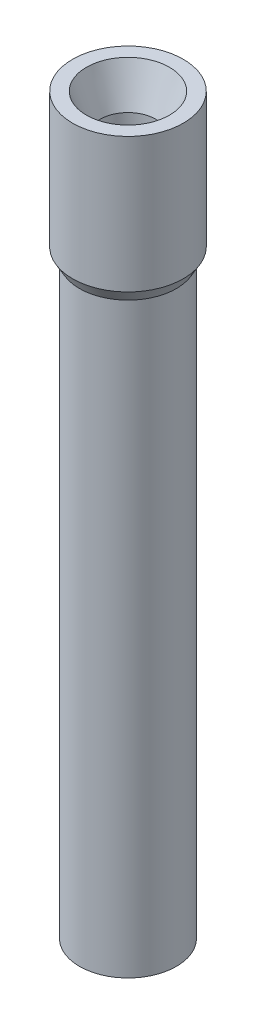
ISO-10303-21;
HEADER;
FILE_DESCRIPTION(('STEP AP214'),'2;1');
FILE_NAME('part.step','',(''),(''),'','','');
FILE_SCHEMA(('AUTOMOTIVE_DESIGN { 1 0 10303 214 1 1 1 1 }'));
ENDSEC;
DATA;
#1=APPLICATION_CONTEXT('core data for automotive mechanical design processes');
#2=APPLICATION_PROTOCOL_DEFINITION('international standard','automotive_design',2000,#1);
#3=PRODUCT_CONTEXT('',#1,'mechanical');
#4=PRODUCT('Part','Part','',(#3));
#5=PRODUCT_RELATED_PRODUCT_CATEGORY('part','',(#4));
#6=PRODUCT_DEFINITION_FORMATION('','',#4);
#7=PRODUCT_DEFINITION_CONTEXT('part definition',#1,'design');
#8=PRODUCT_DEFINITION('design','',#6,#7);
#9=PRODUCT_DEFINITION_SHAPE('','',#8);
#10=(LENGTH_UNIT() NAMED_UNIT(*) SI_UNIT(.MILLI.,.METRE.));
#11=(NAMED_UNIT(*) PLANE_ANGLE_UNIT() SI_UNIT($,.RADIAN.));
#12=(NAMED_UNIT(*) SI_UNIT($,.STERADIAN.) SOLID_ANGLE_UNIT());
#13=UNCERTAINTY_MEASURE_WITH_UNIT(LENGTH_MEASURE(1.E-05),#10,'distance_accuracy_value','');
#14=(GEOMETRIC_REPRESENTATION_CONTEXT(3) GLOBAL_UNCERTAINTY_ASSIGNED_CONTEXT((#13)) GLOBAL_UNIT_ASSIGNED_CONTEXT((#10,
#11,#12)) REPRESENTATION_CONTEXT('',''));
#15=CARTESIAN_POINT('',(0.,0.,0.));
#16=DIRECTION('',(0.,0.,1.));
#17=DIRECTION('',(1.,0.,0.));
#18=AXIS2_PLACEMENT_3D('',#15,#16,#17);
#19=CARTESIAN_POINT('',(0.,8.,0.));
#20=DIRECTION('',(0.,-1.,0.));
#21=DIRECTION('',(0.,0.,-1.));
#22=AXIS2_PLACEMENT_3D('',#19,#20,#21);
#23=CYLINDRICAL_SURFACE('',#22,4.);
#24=CARTESIAN_POINT('',(0.,-1.73205080756891,0.));
#25=DIRECTION('',(0.,1.,0.));
#26=DIRECTION('',(0.,0.,1.));
#27=AXIS2_PLACEMENT_3D('',#24,#25,#26);
#28=CIRCLE('',#27,4.);
#29=CARTESIAN_POINT('',(0.,-1.73205080756891,4.));
#30=VERTEX_POINT('',#29);
#31=EDGE_CURVE('E51',#30,#30,#28,.T.);
#32=ORIENTED_EDGE('',*,*,#31,.T.);
#33=EDGE_LOOP('',(#32));
#34=FACE_BOUND('',#33,.T.);
#35=CARTESIAN_POINT('',(0.,8.,0.));
#36=DIRECTION('',(0.,1.,0.));
#37=DIRECTION('',(0.,0.,1.));
#38=AXIS2_PLACEMENT_3D('',#35,#36,#37);
#39=CIRCLE('',#38,4.);
#40=CARTESIAN_POINT('',(0.,8.,4.));
#41=VERTEX_POINT('',#40);
#42=EDGE_CURVE('E60',#41,#41,#39,.T.);
#43=ORIENTED_EDGE('',*,*,#42,.F.);
#44=EDGE_LOOP('',(#43));
#45=FACE_BOUND('',#44,.T.);
#46=ADVANCED_FACE('F39',(#34,#45),#23,.T.);
#47=CARTESIAN_POINT('',(0.,8.,0.));
#48=DIRECTION('',(0.,1.,0.));
#49=DIRECTION('',(0.,0.,1.));
#50=AXIS2_PLACEMENT_3D('',#47,#48,#49);
#51=PLANE('',#50);
#52=CARTESIAN_POINT('',(0.,8.,0.));
#53=DIRECTION('',(0.,1.,0.));
#54=DIRECTION('',(0.,0.,1.));
#55=AXIS2_PLACEMENT_3D('',#52,#53,#54);
#56=CIRCLE('',#55,3.);
#57=CARTESIAN_POINT('',(0.,8.,3.));
#58=VERTEX_POINT('',#57);
#59=EDGE_CURVE('E10',#58,#58,#56,.F.);
#60=ORIENTED_EDGE('',*,*,#59,.T.);
#61=EDGE_LOOP('',(#60));
#62=FACE_BOUND('',#61,.T.);
#63=ORIENTED_EDGE('',*,*,#42,.T.);
#64=EDGE_LOOP('',(#63));
#65=FACE_BOUND('',#64,.T.);
#66=ADVANCED_FACE('F81',(#62,#65),#51,.T.);
#67=CARTESIAN_POINT('',(0.,-45.,0.));
#68=DIRECTION('',(0.,1.,0.));
#69=DIRECTION('',(0.,0.,1.));
#70=AXIS2_PLACEMENT_3D('',#67,#68,#69);
#71=CYLINDRICAL_SURFACE('',#70,3.5);
#72=CARTESIAN_POINT('',(0.,-2.59807621135336,0.));
#73=DIRECTION('',(0.,1.,0.));
#74=DIRECTION('',(0.,0.,1.));
#75=AXIS2_PLACEMENT_3D('',#72,#73,#74);
#76=CIRCLE('',#75,3.5);
#77=CARTESIAN_POINT('',(0.,-2.59807621135336,3.5));
#78=VERTEX_POINT('',#77);
#79=EDGE_CURVE('E55',#78,#78,#76,.F.);
#80=CARTESIAN_POINT('',(0.,-45.,0.));
#81=DIRECTION('',(0.,-1.,0.));
#82=DIRECTION('',(0.,0.,-1.));
#83=AXIS2_PLACEMENT_3D('',#80,#81,#82);
#84=CIRCLE('',#83,3.5);
#85=CARTESIAN_POINT('',(0.,-45.,3.5));
#86=VERTEX_POINT('',#85);
#87=EDGE_CURVE('E63',#86,#86,#84,.T.);
#88=CARTESIAN_POINT('',(0.,-2.59807621135336,3.5));
#89=CARTESIAN_POINT('',(0.,-3.0397629174851,3.5));
#90=CARTESIAN_POINT('',(0.,-3.48144962361683,3.5));
#91=CARTESIAN_POINT('',(0.,-4.36482303588031,3.5));
#92=CARTESIAN_POINT('',(0.,-4.80650974201204,3.5));
#93=CARTESIAN_POINT('',(0.,-5.68988315427551,3.5));
#94=CARTESIAN_POINT('',(0.,-6.13156986040725,3.5));
#95=CARTESIAN_POINT('',(0.,-7.01494327267072,3.5));
#96=CARTESIAN_POINT('',(0.,-7.45662997880246,3.5));
#97=CARTESIAN_POINT('',(0.,-8.34000339106593,3.5));
#98=CARTESIAN_POINT('',(0.,-8.78169009719767,3.5));
#99=CARTESIAN_POINT('',(0.,-9.66506350946114,3.5));
#100=CARTESIAN_POINT('',(0.,-10.1067502155929,3.5));
#101=CARTESIAN_POINT('',(0.,-10.9901236278563,3.5));
#102=CARTESIAN_POINT('',(0.,-11.4318103339881,3.5));
#103=CARTESIAN_POINT('',(0.,-12.3151837462515,3.5));
#104=CARTESIAN_POINT('',(0.,-12.7568704523833,3.5));
#105=CARTESIAN_POINT('',(0.,-13.6402438646468,3.5));
#106=CARTESIAN_POINT('',(0.,-14.0819305707785,3.5));
#107=CARTESIAN_POINT('',(0.,-14.965303983042,3.5));
#108=CARTESIAN_POINT('',(0.,-15.4069906891737,3.5));
#109=CARTESIAN_POINT('',(0.,-16.2903641014372,3.5));
#110=CARTESIAN_POINT('',(0.,-16.7320508075689,3.5));
#111=CARTESIAN_POINT('',(0.,-17.6154242198324,3.5));
#112=CARTESIAN_POINT('',(0.,-18.0571109259641,3.5));
#113=CARTESIAN_POINT('',(0.,-18.9404843382276,3.5));
#114=CARTESIAN_POINT('',(0.,-19.3821710443593,3.5));
#115=CARTESIAN_POINT('',(0.,-20.2655444566228,3.5));
#116=CARTESIAN_POINT('',(0.,-20.7072311627545,3.5));
#117=CARTESIAN_POINT('',(0.,-21.590604575018,3.5));
#118=CARTESIAN_POINT('',(0.,-22.0322912811497,3.5));
#119=CARTESIAN_POINT('',(0.,-22.9156646934132,3.5));
#120=CARTESIAN_POINT('',(0.,-23.3573513995449,3.5));
#121=CARTESIAN_POINT('',(0.,-24.2407248118084,3.5));
#122=CARTESIAN_POINT('',(0.,-24.6824115179401,3.5));
#123=CARTESIAN_POINT('',(0.,-25.5657849302036,3.5));
#124=CARTESIAN_POINT('',(0.,-26.0074716363354,3.5));
#125=CARTESIAN_POINT('',(0.,-26.8908450485988,3.5));
#126=CARTESIAN_POINT('',(0.,-27.3325317547306,3.5));
#127=CARTESIAN_POINT('',(0.,-28.215905166994,3.5));
#128=CARTESIAN_POINT('',(0.,-28.6575918731258,3.5));
#129=CARTESIAN_POINT('',(0.,-29.5409652853892,3.5));
#130=CARTESIAN_POINT('',(0.,-29.982651991521,3.5));
#131=CARTESIAN_POINT('',(0.,-30.8660254037845,3.5));
#132=CARTESIAN_POINT('',(0.,-31.3077121099162,3.5));
#133=CARTESIAN_POINT('',(0.,-32.1910855221797,3.5));
#134=CARTESIAN_POINT('',(0.,-32.6327722283114,3.5));
#135=CARTESIAN_POINT('',(0.,-33.5161456405749,3.5));
#136=CARTESIAN_POINT('',(0.,-33.9578323467066,3.5));
#137=CARTESIAN_POINT('',(0.,-34.8412057589701,3.5));
#138=CARTESIAN_POINT('',(0.,-35.2828924651018,3.5));
#139=CARTESIAN_POINT('',(0.,-36.1662658773653,3.5));
#140=CARTESIAN_POINT('',(0.,-36.607952583497,3.5));
#141=CARTESIAN_POINT('',(0.,-37.4913259957605,3.5));
#142=CARTESIAN_POINT('',(0.,-37.9330127018922,3.5));
#143=CARTESIAN_POINT('',(0.,-38.8163861141557,3.5));
#144=CARTESIAN_POINT('',(0.,-39.2580728202874,3.5));
#145=CARTESIAN_POINT('',(0.,-40.1414462325509,3.5));
#146=CARTESIAN_POINT('',(0.,-40.5831329386826,3.5));
#147=CARTESIAN_POINT('',(0.,-41.4665063509461,3.5));
#148=CARTESIAN_POINT('',(0.,-41.9081930570778,3.5));
#149=CARTESIAN_POINT('',(0.,-42.7915664693413,3.5));
#150=CARTESIAN_POINT('',(0.,-43.2332531754731,3.5));
#151=CARTESIAN_POINT('',(0.,-44.1166265877365,3.5));
#152=CARTESIAN_POINT('',(0.,-44.5583132938683,3.5));
#153=CARTESIAN_POINT('',(0.,-45.,3.5));
#154=B_SPLINE_CURVE_WITH_KNOTS('',3,(#88,#89,#90,#91,#92,#93,#94,#95,#96,#97,#98,#99,#100,#101,
#102,#103,#104,#105,#106,#107,#108,#109,#110,#111,#112,#113,#114,#115,#116,#117,#118,#119,#120,
#121,#122,#123,#124,#125,#126,#127,#128,#129,#130,#131,#132,#133,#134,#135,#136,#137,#138,#139,
#140,#141,#142,#143,#144,#145,#146,#147,#148,#149,#150,#151,#152,#153),.UNSPECIFIED.,.F.,.F.,(4,
2,2,2,2,2,2,2,2,2,2,2,2,2,2,2,2,2,2,2,2,2,2,2,2,2,2,2,2,2,2,2,4),(0.,1.32506011839521,
2.65012023679041,3.97518035518563,5.30024047358083,6.62530059197604,7.95036071037124,
9.27542082876645,10.6004809471617,11.9255410655569,13.2506011839521,14.5756613023473,
15.9007214207425,17.2257815391377,18.5508416575329,19.8759017759281,21.2009618943233,
22.5260220127185,23.8510821311137,25.1761422495089,26.5012023679041,27.8262624862994,
29.1513226046946,30.4763827230898,31.801442841485,33.1265029598802,34.4515630782754,
35.7766231966706,37.1016833150658,38.426743433461,39.7518035518562,41.0768636702514,
42.4019237886466),.UNSPECIFIED.);
#155=EDGE_CURVE('BSEAM76',#78,#86,#154,.T.);
#156=ORIENTED_EDGE('',*,*,#79,.T.);
#157=ORIENTED_EDGE('',*,*,#87,.F.);
#158=ORIENTED_EDGE('',*,*,#155,.T.);
#159=ORIENTED_EDGE('',*,*,#155,.F.);
#160=EDGE_LOOP('',(#156,#158,#157,#159));
#161=FACE_BOUND('',#160,.T.);
#162=ADVANCED_FACE('F76',(#161),#71,.T.);
#163=CARTESIAN_POINT('',(0.,-45.,0.));
#164=DIRECTION('',(0.,-1.,0.));
#165=DIRECTION('',(0.,0.,-1.));
#166=AXIS2_PLACEMENT_3D('',#163,#164,#165);
#167=PLANE('',#166);
#168=CARTESIAN_POINT('',(0.,-45.,0.));
#169=DIRECTION('',(0.,-1.,0.));
#170=DIRECTION('',(0.,0.,-1.));
#171=AXIS2_PLACEMENT_3D('',#168,#169,#170);
#172=CIRCLE('',#171,2.);
#173=CARTESIAN_POINT('',(0.,-45.,-2.));
#174=VERTEX_POINT('',#173);
#175=EDGE_CURVE('E66',#174,#174,#172,.T.);
#176=ORIENTED_EDGE('',*,*,#175,.F.);
#177=EDGE_LOOP('',(#176));
#178=FACE_BOUND('',#177,.T.);
#179=ORIENTED_EDGE('',*,*,#87,.T.);
#180=EDGE_LOOP('',(#179));
#181=FACE_BOUND('',#180,.T.);
#182=ADVANCED_FACE('F72',(#178,#181),#167,.T.);
#183=CARTESIAN_POINT('',(0.,-2.59807621135336,0.));
#184=DIRECTION('',(0.,1.,0.));
#185=DIRECTION('',(0.,0.,1.));
#186=AXIS2_PLACEMENT_3D('',#183,#184,#185);
#187=CONICAL_SURFACE('',#186,3.5,0.523598775598294);
#188=ORIENTED_EDGE('',*,*,#31,.F.);
#189=EDGE_LOOP('',(#188));
#190=FACE_BOUND('',#189,.T.);
#191=ORIENTED_EDGE('',*,*,#79,.F.);
#192=EDGE_LOOP('',(#191));
#193=FACE_BOUND('',#192,.T.);
#194=ADVANCED_FACE('F75',(#190,#193),#187,.T.);
#195=CARTESIAN_POINT('',(0.,56.0000000000001,0.));
#196=DIRECTION('',(0.,-1.,0.));
#197=DIRECTION('',(0.,0.,-1.));
#198=AXIS2_PLACEMENT_3D('',#195,#196,#197);
#199=CYLINDRICAL_SURFACE('',#198,2.);
#200=CARTESIAN_POINT('',(0.,5.25252258054539,0.));
#201=DIRECTION('',(0.,1.,0.));
#202=DIRECTION('',(0.,0.,1.));
#203=AXIS2_PLACEMENT_3D('',#200,#201,#202);
#204=CIRCLE('',#203,2.);
#205=CARTESIAN_POINT('',(0.,5.25252258054539,2.));
#206=VERTEX_POINT('',#205);
#207=EDGE_CURVE('E47',#206,#206,#204,.T.);
#208=ORIENTED_EDGE('',*,*,#207,.T.);
#209=EDGE_LOOP('',(#208));
#210=FACE_BOUND('',#209,.T.);
#211=ORIENTED_EDGE('',*,*,#175,.T.);
#212=EDGE_LOOP('',(#211));
#213=FACE_BOUND('',#212,.T.);
#214=ADVANCED_FACE('F70',(#210,#213),#199,.F.);
#215=CARTESIAN_POINT('',(0.,5.25252258054539,0.));
#216=DIRECTION('',(0.,1.,0.));
#217=DIRECTION('',(0.,0.,1.));
#218=AXIS2_PLACEMENT_3D('',#215,#216,#217);
#219=CONICAL_SURFACE('',#218,2.,0.349065850398867);
#220=ORIENTED_EDGE('',*,*,#59,.F.);
#221=EDGE_LOOP('',(#220));
#222=FACE_BOUND('',#221,.T.);
#223=ORIENTED_EDGE('',*,*,#207,.F.);
#224=EDGE_LOOP('',(#223));
#225=FACE_BOUND('',#224,.T.);
#226=ADVANCED_FACE('F42',(#222,#225),#219,.F.);
#227=CLOSED_SHELL('',(#46,#66,#162,#182,#194,#214,#226));
#228=MANIFOLD_SOLID_BREP('B2',#227);
#229=ADVANCED_BREP_SHAPE_REPRESENTATION('',(#18,#228),#14);
#230=SHAPE_DEFINITION_REPRESENTATION(#9,#229);
ENDSEC;
END-ISO-10303-21;
